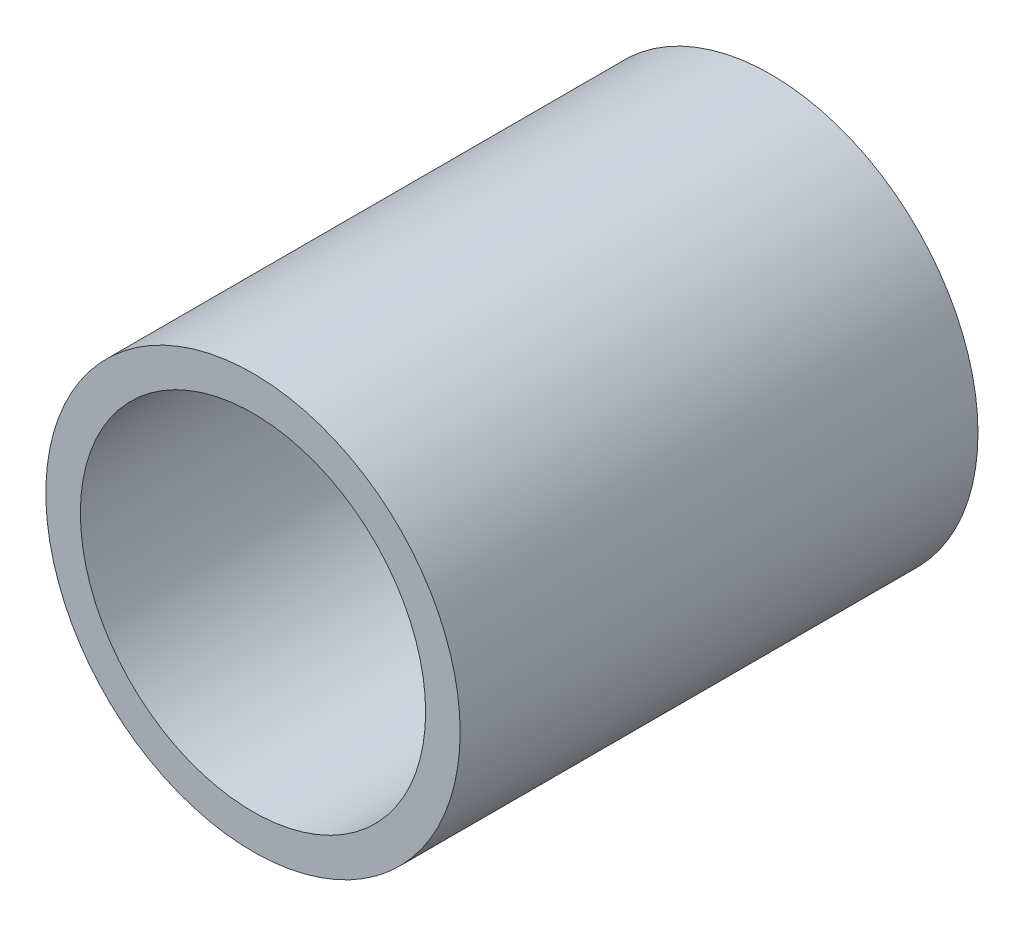
ISO-10303-21;
HEADER;
FILE_DESCRIPTION(('STEP AP214'),'2;1');
FILE_NAME('part.step','',(''),(''),'','','');
FILE_SCHEMA(('AUTOMOTIVE_DESIGN { 1 0 10303 214 1 1 1 1 }'));
ENDSEC;
DATA;
#1=APPLICATION_CONTEXT('core data for automotive mechanical design processes');
#2=APPLICATION_PROTOCOL_DEFINITION('international standard','automotive_design',2000,#1);
#3=PRODUCT_CONTEXT('',#1,'mechanical');
#4=PRODUCT('Part','Part','',(#3));
#5=PRODUCT_RELATED_PRODUCT_CATEGORY('part','',(#4));
#6=PRODUCT_DEFINITION_FORMATION('','',#4);
#7=PRODUCT_DEFINITION_CONTEXT('part definition',#1,'design');
#8=PRODUCT_DEFINITION('design','',#6,#7);
#9=PRODUCT_DEFINITION_SHAPE('','',#8);
#10=(LENGTH_UNIT() NAMED_UNIT(*) SI_UNIT(.MILLI.,.METRE.));
#11=(NAMED_UNIT(*) PLANE_ANGLE_UNIT() SI_UNIT($,.RADIAN.));
#12=(NAMED_UNIT(*) SI_UNIT($,.STERADIAN.) SOLID_ANGLE_UNIT());
#13=UNCERTAINTY_MEASURE_WITH_UNIT(LENGTH_MEASURE(1.E-05),#10,'distance_accuracy_value','');
#14=(GEOMETRIC_REPRESENTATION_CONTEXT(3) GLOBAL_UNCERTAINTY_ASSIGNED_CONTEXT((#13)) GLOBAL_UNIT_ASSIGNED_CONTEXT((#10,
#11,#12)) REPRESENTATION_CONTEXT('',''));
#15=CARTESIAN_POINT('',(0.,0.,0.));
#16=DIRECTION('',(0.,0.,1.));
#17=DIRECTION('',(1.,0.,0.));
#18=AXIS2_PLACEMENT_3D('',#15,#16,#17);
#19=CARTESIAN_POINT('',(0.,0.,15.));
#20=DIRECTION('',(0.,0.,1.));
#21=DIRECTION('',(1.,0.,0.));
#22=AXIS2_PLACEMENT_3D('',#19,#20,#21);
#23=PLANE('',#22);
#24=CARTESIAN_POINT('',(0.,0.,15.));
#25=DIRECTION('',(0.,0.,1.));
#26=DIRECTION('',(1.,0.,0.));
#27=AXIS2_PLACEMENT_3D('',#24,#25,#26);
#28=CIRCLE('',#27,6.);
#29=CARTESIAN_POINT('',(6.,0.,15.));
#30=VERTEX_POINT('',#29);
#31=EDGE_CURVE('E10',#30,#30,#28,.T.);
#32=ORIENTED_EDGE('',*,*,#31,.T.);
#33=EDGE_LOOP('',(#32));
#34=FACE_BOUND('',#33,.T.);
#35=CARTESIAN_POINT('',(0.,0.,15.));
#36=DIRECTION('',(0.,0.,1.));
#37=DIRECTION('',(1.,0.,0.));
#38=AXIS2_PLACEMENT_3D('',#35,#36,#37);
#39=CIRCLE('',#38,5.);
#40=CARTESIAN_POINT('',(5.,0.,15.));
#41=VERTEX_POINT('',#40);
#42=EDGE_CURVE('E42',#41,#41,#39,.T.);
#43=ORIENTED_EDGE('',*,*,#42,.F.);
#44=EDGE_LOOP('',(#43));
#45=FACE_BOUND('',#44,.T.);
#46=ADVANCED_FACE('F31',(#34,#45),#23,.T.);
#47=CARTESIAN_POINT('',(0.,0.,0.));
#48=DIRECTION('',(0.,0.,1.));
#49=DIRECTION('',(1.,0.,0.));
#50=AXIS2_PLACEMENT_3D('',#47,#48,#49);
#51=PLANE('',#50);
#52=CARTESIAN_POINT('',(0.,0.,0.));
#53=DIRECTION('',(0.,0.,1.));
#54=DIRECTION('',(1.,0.,0.));
#55=AXIS2_PLACEMENT_3D('',#52,#53,#54);
#56=CIRCLE('',#55,6.);
#57=CARTESIAN_POINT('',(6.,0.,0.));
#58=VERTEX_POINT('',#57);
#59=EDGE_CURVE('E35',#58,#58,#56,.T.);
#60=ORIENTED_EDGE('',*,*,#59,.F.);
#61=EDGE_LOOP('',(#60));
#62=FACE_BOUND('',#61,.T.);
#63=CARTESIAN_POINT('',(0.,0.,0.));
#64=DIRECTION('',(0.,0.,1.));
#65=DIRECTION('',(1.,0.,0.));
#66=AXIS2_PLACEMENT_3D('',#63,#64,#65);
#67=CIRCLE('',#66,5.);
#68=CARTESIAN_POINT('',(5.,0.,0.));
#69=VERTEX_POINT('',#68);
#70=EDGE_CURVE('E44',#69,#69,#67,.T.);
#71=ORIENTED_EDGE('',*,*,#70,.T.);
#72=EDGE_LOOP('',(#71));
#73=FACE_BOUND('',#72,.T.);
#74=ADVANCED_FACE('F54',(#62,#73),#51,.F.);
#75=CARTESIAN_POINT('',(0.,0.,15.));
#76=DIRECTION('',(0.,0.,-1.));
#77=DIRECTION('',(-1.,0.,0.));
#78=AXIS2_PLACEMENT_3D('',#75,#76,#77);
#79=CYLINDRICAL_SURFACE('',#78,6.);
#80=ORIENTED_EDGE('',*,*,#31,.F.);
#81=EDGE_LOOP('',(#80));
#82=FACE_BOUND('',#81,.T.);
#83=ORIENTED_EDGE('',*,*,#59,.T.);
#84=EDGE_LOOP('',(#83));
#85=FACE_BOUND('',#84,.T.);
#86=ADVANCED_FACE('F33',(#82,#85),#79,.T.);
#87=CARTESIAN_POINT('',(0.,0.,15.));
#88=DIRECTION('',(0.,0.,-1.));
#89=DIRECTION('',(-1.,0.,0.));
#90=AXIS2_PLACEMENT_3D('',#87,#88,#89);
#91=CYLINDRICAL_SURFACE('',#90,5.);
#92=ORIENTED_EDGE('',*,*,#42,.T.);
#93=EDGE_LOOP('',(#92));
#94=FACE_BOUND('',#93,.T.);
#95=ORIENTED_EDGE('',*,*,#70,.F.);
#96=EDGE_LOOP('',(#95));
#97=FACE_BOUND('',#96,.T.);
#98=ADVANCED_FACE('F50',(#94,#97),#91,.F.);
#99=CLOSED_SHELL('',(#46,#74,#86,#98));
#100=MANIFOLD_SOLID_BREP('B2',#99);
#101=ADVANCED_BREP_SHAPE_REPRESENTATION('',(#18,#100),#14);
#102=SHAPE_DEFINITION_REPRESENTATION(#9,#101);
ENDSEC;
END-ISO-10303-21;
